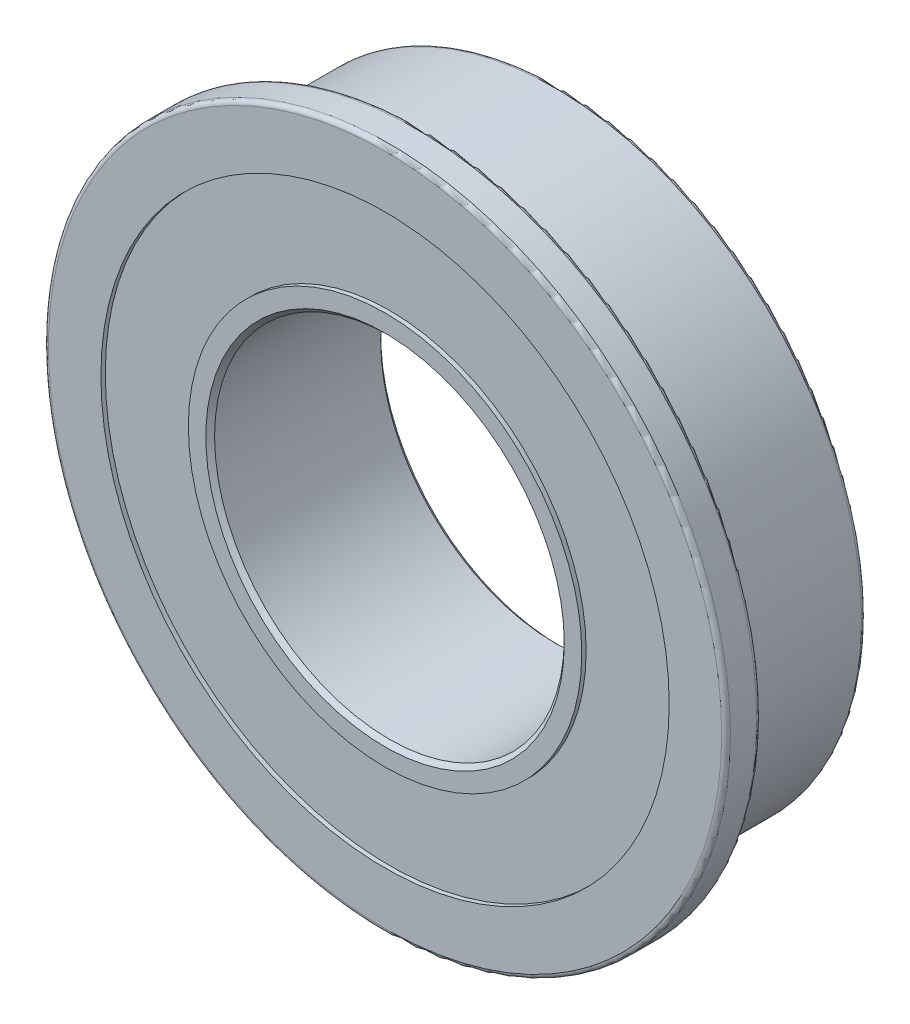
ISO-10303-21;
HEADER;
FILE_DESCRIPTION(('STEP AP214'),'2;1');
FILE_NAME('part.step','',(''),(''),'','','');
FILE_SCHEMA(('AUTOMOTIVE_DESIGN { 1 0 10303 214 1 1 1 1 }'));
ENDSEC;
DATA;
#1=APPLICATION_CONTEXT('core data for automotive mechanical design processes');
#2=APPLICATION_PROTOCOL_DEFINITION('international standard','automotive_design',2000,#1);
#3=PRODUCT_CONTEXT('',#1,'mechanical');
#4=PRODUCT('Part','Part','',(#3));
#5=PRODUCT_RELATED_PRODUCT_CATEGORY('part','',(#4));
#6=PRODUCT_DEFINITION_FORMATION('','',#4);
#7=PRODUCT_DEFINITION_CONTEXT('part definition',#1,'design');
#8=PRODUCT_DEFINITION('design','',#6,#7);
#9=PRODUCT_DEFINITION_SHAPE('','',#8);
#10=(LENGTH_UNIT() NAMED_UNIT(*) SI_UNIT(.MILLI.,.METRE.));
#11=(NAMED_UNIT(*) PLANE_ANGLE_UNIT() SI_UNIT($,.RADIAN.));
#12=(NAMED_UNIT(*) SI_UNIT($,.STERADIAN.) SOLID_ANGLE_UNIT());
#13=UNCERTAINTY_MEASURE_WITH_UNIT(LENGTH_MEASURE(1.E-05),#10,'distance_accuracy_value','');
#14=(GEOMETRIC_REPRESENTATION_CONTEXT(3) GLOBAL_UNCERTAINTY_ASSIGNED_CONTEXT((#13)) GLOBAL_UNIT_ASSIGNED_CONTEXT((#10,
#11,#12)) REPRESENTATION_CONTEXT('',''));
#15=CARTESIAN_POINT('',(0.,0.,0.));
#16=DIRECTION('',(0.,0.,1.));
#17=DIRECTION('',(1.,0.,0.));
#18=AXIS2_PLACEMENT_3D('',#15,#16,#17);
#19=CARTESIAN_POINT('',(0.,0.,0.));
#20=DIRECTION('',(0.,0.,1.));
#21=DIRECTION('',(1.,0.,0.));
#22=AXIS2_PLACEMENT_3D('',#19,#20,#21);
#23=PLANE('',#22);
#24=CARTESIAN_POINT('',(0.,0.,0.));
#25=DIRECTION('',(0.,0.,1.));
#26=DIRECTION('',(1.,0.,0.));
#27=AXIS2_PLACEMENT_3D('',#24,#25,#26);
#28=CIRCLE('',#27,4.1);
#29=CARTESIAN_POINT('',(4.1,0.,0.));
#30=VERTEX_POINT('',#29);
#31=EDGE_CURVE('E28',#30,#30,#28,.T.);
#32=ORIENTED_EDGE('',*,*,#31,.T.);
#33=EDGE_LOOP('',(#32));
#34=FACE_BOUND('',#33,.T.);
#35=CARTESIAN_POINT('',(0.,0.,0.));
#36=DIRECTION('',(0.,0.,-1.));
#37=DIRECTION('',(-1.,0.,0.));
#38=AXIS2_PLACEMENT_3D('',#35,#36,#37);
#39=CIRCLE('',#38,4.5);
#40=CARTESIAN_POINT('',(-4.5,0.,0.));
#41=VERTEX_POINT('',#40);
#42=EDGE_CURVE('E74',#41,#41,#39,.T.);
#43=ORIENTED_EDGE('',*,*,#42,.T.);
#44=EDGE_LOOP('',(#43));
#45=FACE_BOUND('',#44,.T.);
#46=ADVANCED_FACE('F15',(#34,#45),#23,.F.);
#47=CARTESIAN_POINT('',(0.,0.,4.));
#48=DIRECTION('',(0.,0.,1.));
#49=DIRECTION('',(1.,0.,0.));
#50=AXIS2_PLACEMENT_3D('',#47,#48,#49);
#51=PLANE('',#50);
#52=CARTESIAN_POINT('',(0.,0.,4.));
#53=DIRECTION('',(0.,0.,1.));
#54=DIRECTION('',(1.,0.,0.));
#55=AXIS2_PLACEMENT_3D('',#52,#53,#54);
#56=CIRCLE('',#55,4.1);
#57=CARTESIAN_POINT('',(4.1,0.,4.));
#58=VERTEX_POINT('',#57);
#59=EDGE_CURVE('E10',#58,#58,#56,.F.);
#60=ORIENTED_EDGE('',*,*,#59,.T.);
#61=EDGE_LOOP('',(#60));
#62=FACE_BOUND('',#61,.T.);
#63=CARTESIAN_POINT('',(0.,0.,4.));
#64=DIRECTION('',(0.,0.,1.));
#65=DIRECTION('',(1.,0.,0.));
#66=AXIS2_PLACEMENT_3D('',#63,#64,#65);
#67=CIRCLE('',#66,4.5);
#68=CARTESIAN_POINT('',(4.5,0.,4.));
#69=VERTEX_POINT('',#68);
#70=EDGE_CURVE('E64',#69,#69,#67,.T.);
#71=ORIENTED_EDGE('',*,*,#70,.T.);
#72=EDGE_LOOP('',(#71));
#73=FACE_BOUND('',#72,.T.);
#74=ADVANCED_FACE('F111',(#62,#73),#51,.T.);
#75=CARTESIAN_POINT('',(0.,0.,4.));
#76=DIRECTION('',(0.,0.,-1.));
#77=DIRECTION('',(-1.,0.,0.));
#78=AXIS2_PLACEMENT_3D('',#75,#76,#77);
#79=CYLINDRICAL_SURFACE('',#78,7.);
#80=CARTESIAN_POINT('',(0.,0.,0.1));
#81=DIRECTION('',(0.,0.,1.));
#82=DIRECTION('',(1.,0.,0.));
#83=AXIS2_PLACEMENT_3D('',#80,#81,#82);
#84=CIRCLE('',#83,7.);
#85=CARTESIAN_POINT('',(7.,0.,0.1));
#86=VERTEX_POINT('',#85);
#87=EDGE_CURVE('E49',#86,#86,#84,.T.);
#88=ORIENTED_EDGE('',*,*,#87,.T.);
#89=EDGE_LOOP('',(#88));
#90=FACE_BOUND('',#89,.T.);
#91=CARTESIAN_POINT('',(0.,0.,3.2));
#92=DIRECTION('',(0.,0.,1.));
#93=DIRECTION('',(1.,0.,0.));
#94=AXIS2_PLACEMENT_3D('',#91,#92,#93);
#95=CIRCLE('',#94,7.);
#96=CARTESIAN_POINT('',(7.,0.,3.2));
#97=VERTEX_POINT('',#96);
#98=EDGE_CURVE('E52',#97,#97,#95,.T.);
#99=ORIENTED_EDGE('',*,*,#98,.F.);
#100=EDGE_LOOP('',(#99));
#101=FACE_BOUND('',#100,.T.);
#102=ADVANCED_FACE('F112',(#90,#101),#79,.T.);
#103=CARTESIAN_POINT('',(0.,0.,4.));
#104=DIRECTION('',(0.,0.,1.));
#105=DIRECTION('',(1.,0.,0.));
#106=AXIS2_PLACEMENT_3D('',#103,#104,#105);
#107=CIRCLE('',#106,7.7);
#108=CARTESIAN_POINT('',(7.7,0.,4.));
#109=VERTEX_POINT('',#108);
#110=EDGE_CURVE('E34',#109,#109,#107,.T.);
#111=ORIENTED_EDGE('',*,*,#110,.T.);
#112=EDGE_LOOP('',(#111));
#113=FACE_BOUND('',#112,.T.);
#114=CARTESIAN_POINT('',(0.,0.,4.));
#115=DIRECTION('',(0.,0.,1.));
#116=DIRECTION('',(1.,0.,0.));
#117=AXIS2_PLACEMENT_3D('',#114,#115,#116);
#118=CIRCLE('',#117,6.5);
#119=CARTESIAN_POINT('',(6.5,0.,4.));
#120=VERTEX_POINT('',#119);
#121=EDGE_CURVE('E60',#120,#120,#118,.T.);
#122=ORIENTED_EDGE('',*,*,#121,.F.);
#123=EDGE_LOOP('',(#122));
#124=FACE_BOUND('',#123,.T.);
#125=ADVANCED_FACE('F99',(#113,#124),#51,.T.);
#126=CARTESIAN_POINT('',(0.,0.,0.));
#127=DIRECTION('',(0.,0.,1.));
#128=DIRECTION('',(1.,0.,0.));
#129=AXIS2_PLACEMENT_3D('',#126,#127,#128);
#130=CIRCLE('',#129,6.9);
#131=CARTESIAN_POINT('',(6.9,0.,0.));
#132=VERTEX_POINT('',#131);
#133=EDGE_CURVE('E50',#132,#132,#130,.F.);
#134=ORIENTED_EDGE('',*,*,#133,.T.);
#135=EDGE_LOOP('',(#134));
#136=FACE_BOUND('',#135,.T.);
#137=CARTESIAN_POINT('',(0.,0.,0.));
#138=DIRECTION('',(0.,0.,-1.));
#139=DIRECTION('',(-1.,0.,0.));
#140=AXIS2_PLACEMENT_3D('',#137,#138,#139);
#141=CIRCLE('',#140,6.5);
#142=CARTESIAN_POINT('',(-6.5,0.,0.));
#143=VERTEX_POINT('',#142);
#144=EDGE_CURVE('E68',#143,#143,#141,.T.);
#145=ORIENTED_EDGE('',*,*,#144,.F.);
#146=EDGE_LOOP('',(#145));
#147=FACE_BOUND('',#146,.T.);
#148=ADVANCED_FACE('F100',(#136,#147),#23,.F.);
#149=CARTESIAN_POINT('',(0.,0.,4.));
#150=DIRECTION('',(0.,0.,-1.));
#151=DIRECTION('',(-1.,0.,0.));
#152=AXIS2_PLACEMENT_3D('',#149,#150,#151);
#153=CYLINDRICAL_SURFACE('',#152,4.);
#154=CARTESIAN_POINT('',(0.,0.,0.1));
#155=DIRECTION('',(0.,0.,1.));
#156=DIRECTION('',(1.,0.,0.));
#157=AXIS2_PLACEMENT_3D('',#154,#155,#156);
#158=CIRCLE('',#157,4.);
#159=CARTESIAN_POINT('',(4.,0.,0.1));
#160=VERTEX_POINT('',#159);
#161=EDGE_CURVE('E22',#160,#160,#158,.F.);
#162=ORIENTED_EDGE('',*,*,#161,.T.);
#163=EDGE_LOOP('',(#162));
#164=FACE_BOUND('',#163,.T.);
#165=CARTESIAN_POINT('',(0.,0.,3.9));
#166=DIRECTION('',(0.,0.,1.));
#167=DIRECTION('',(1.,0.,0.));
#168=AXIS2_PLACEMENT_3D('',#165,#166,#167);
#169=CIRCLE('',#168,4.);
#170=CARTESIAN_POINT('',(4.,0.,3.9));
#171=VERTEX_POINT('',#170);
#172=EDGE_CURVE('E27',#171,#171,#169,.T.);
#173=ORIENTED_EDGE('',*,*,#172,.T.);
#174=EDGE_LOOP('',(#173));
#175=FACE_BOUND('',#174,.T.);
#176=ADVANCED_FACE('F97',(#164,#175),#153,.F.);
#177=CARTESIAN_POINT('',(0.,0.,3.2));
#178=DIRECTION('',(0.,0.,1.));
#179=DIRECTION('',(1.,0.,0.));
#180=AXIS2_PLACEMENT_3D('',#177,#178,#179);
#181=PLANE('',#180);
#182=CARTESIAN_POINT('',(0.,0.,3.2));
#183=DIRECTION('',(0.,0.,1.));
#184=DIRECTION('',(1.,0.,0.));
#185=AXIS2_PLACEMENT_3D('',#182,#183,#184);
#186=CIRCLE('',#185,7.7);
#187=CARTESIAN_POINT('',(7.7,0.,3.2));
#188=VERTEX_POINT('',#187);
#189=EDGE_CURVE('E36',#188,#188,#186,.F.);
#190=ORIENTED_EDGE('',*,*,#189,.T.);
#191=EDGE_LOOP('',(#190));
#192=FACE_BOUND('',#191,.T.);
#193=ORIENTED_EDGE('',*,*,#98,.T.);
#194=EDGE_LOOP('',(#193));
#195=FACE_BOUND('',#194,.T.);
#196=ADVANCED_FACE('F108',(#192,#195),#181,.F.);
#197=CARTESIAN_POINT('',(0.,0.,3.2));
#198=DIRECTION('',(0.,0.,1.));
#199=DIRECTION('',(1.,0.,0.));
#200=AXIS2_PLACEMENT_3D('',#197,#198,#199);
#201=CYLINDRICAL_SURFACE('',#200,7.8);
#202=CARTESIAN_POINT('',(0.,0.,3.3));
#203=DIRECTION('',(0.,0.,1.));
#204=DIRECTION('',(1.,0.,0.));
#205=AXIS2_PLACEMENT_3D('',#202,#203,#204);
#206=CIRCLE('',#205,7.8);
#207=CARTESIAN_POINT('',(7.8,0.,3.3));
#208=VERTEX_POINT('',#207);
#209=EDGE_CURVE('E41',#208,#208,#206,.T.);
#210=ORIENTED_EDGE('',*,*,#209,.T.);
#211=EDGE_LOOP('',(#210));
#212=FACE_BOUND('',#211,.T.);
#213=CARTESIAN_POINT('',(0.,0.,3.9));
#214=DIRECTION('',(0.,0.,1.));
#215=DIRECTION('',(1.,0.,0.));
#216=AXIS2_PLACEMENT_3D('',#213,#214,#215);
#217=CIRCLE('',#216,7.8);
#218=CARTESIAN_POINT('',(7.8,0.,3.9));
#219=VERTEX_POINT('',#218);
#220=EDGE_CURVE('E42',#219,#219,#217,.F.);
#221=ORIENTED_EDGE('',*,*,#220,.T.);
#222=EDGE_LOOP('',(#221));
#223=FACE_BOUND('',#222,.T.);
#224=ADVANCED_FACE('F150',(#212,#223),#201,.T.);
#225=CARTESIAN_POINT('',(0.,0.,3.9));
#226=DIRECTION('',(0.,0.,1.));
#227=DIRECTION('',(1.,0.,0.));
#228=AXIS2_PLACEMENT_3D('',#225,#226,#227);
#229=CYLINDRICAL_SURFACE('',#228,6.5);
#230=CARTESIAN_POINT('',(0.,0.,3.9));
#231=DIRECTION('',(0.,0.,1.));
#232=DIRECTION('',(1.,0.,0.));
#233=AXIS2_PLACEMENT_3D('',#230,#231,#232);
#234=CIRCLE('',#233,6.5);
#235=CARTESIAN_POINT('',(6.5,0.,3.9));
#236=VERTEX_POINT('',#235);
#237=EDGE_CURVE('E57',#236,#236,#234,.T.);
#238=ORIENTED_EDGE('',*,*,#237,.F.);
#239=EDGE_LOOP('',(#238));
#240=FACE_BOUND('',#239,.T.);
#241=ORIENTED_EDGE('',*,*,#121,.T.);
#242=EDGE_LOOP('',(#241));
#243=FACE_BOUND('',#242,.T.);
#244=ADVANCED_FACE('F141',(#240,#243),#229,.F.);
#245=CARTESIAN_POINT('',(0.,0.,3.9));
#246=DIRECTION('',(0.,0.,1.));
#247=DIRECTION('',(1.,0.,0.));
#248=AXIS2_PLACEMENT_3D('',#245,#246,#247);
#249=PLANE('',#248);
#250=CARTESIAN_POINT('',(0.,0.,3.9));
#251=DIRECTION('',(0.,0.,1.));
#252=DIRECTION('',(1.,0.,0.));
#253=AXIS2_PLACEMENT_3D('',#250,#251,#252);
#254=CIRCLE('',#253,4.5);
#255=CARTESIAN_POINT('',(4.5,0.,3.9));
#256=VERTEX_POINT('',#255);
#257=EDGE_CURVE('E58',#256,#256,#254,.T.);
#258=ORIENTED_EDGE('',*,*,#257,.F.);
#259=EDGE_LOOP('',(#258));
#260=FACE_BOUND('',#259,.T.);
#261=ORIENTED_EDGE('',*,*,#237,.T.);
#262=EDGE_LOOP('',(#261));
#263=FACE_BOUND('',#262,.T.);
#264=ADVANCED_FACE('F136',(#260,#263),#249,.T.);
#265=CARTESIAN_POINT('',(0.,0.,3.9));
#266=DIRECTION('',(0.,0.,1.));
#267=DIRECTION('',(1.,0.,0.));
#268=AXIS2_PLACEMENT_3D('',#265,#266,#267);
#269=CYLINDRICAL_SURFACE('',#268,4.5);
#270=ORIENTED_EDGE('',*,*,#257,.T.);
#271=EDGE_LOOP('',(#270));
#272=FACE_BOUND('',#271,.T.);
#273=ORIENTED_EDGE('',*,*,#70,.F.);
#274=EDGE_LOOP('',(#273));
#275=FACE_BOUND('',#274,.T.);
#276=ADVANCED_FACE('F91',(#272,#275),#269,.T.);
#277=CARTESIAN_POINT('',(0.,0.,0.1));
#278=DIRECTION('',(0.,0.,-1.));
#279=DIRECTION('',(-1.,0.,0.));
#280=AXIS2_PLACEMENT_3D('',#277,#278,#279);
#281=CYLINDRICAL_SURFACE('',#280,6.5);
#282=CARTESIAN_POINT('',(0.,0.,0.1));
#283=DIRECTION('',(0.,0.,-1.));
#284=DIRECTION('',(-1.,0.,0.));
#285=AXIS2_PLACEMENT_3D('',#282,#283,#284);
#286=CIRCLE('',#285,6.5);
#287=CARTESIAN_POINT('',(-6.5,0.,0.1));
#288=VERTEX_POINT('',#287);
#289=EDGE_CURVE('E69',#288,#288,#286,.T.);
#290=ORIENTED_EDGE('',*,*,#289,.F.);
#291=EDGE_LOOP('',(#290));
#292=FACE_BOUND('',#291,.T.);
#293=ORIENTED_EDGE('',*,*,#144,.T.);
#294=EDGE_LOOP('',(#293));
#295=FACE_BOUND('',#294,.T.);
#296=ADVANCED_FACE('F87',(#292,#295),#281,.F.);
#297=CARTESIAN_POINT('',(0.,0.,0.1));
#298=DIRECTION('',(0.,0.,-1.));
#299=DIRECTION('',(-1.,0.,0.));
#300=AXIS2_PLACEMENT_3D('',#297,#298,#299);
#301=PLANE('',#300);
#302=CARTESIAN_POINT('',(0.,0.,0.1));
#303=DIRECTION('',(0.,0.,-1.));
#304=DIRECTION('',(-1.,0.,0.));
#305=AXIS2_PLACEMENT_3D('',#302,#303,#304);
#306=CIRCLE('',#305,4.5);
#307=CARTESIAN_POINT('',(-4.5,0.,0.1));
#308=VERTEX_POINT('',#307);
#309=EDGE_CURVE('E71',#308,#308,#306,.T.);
#310=ORIENTED_EDGE('',*,*,#309,.F.);
#311=EDGE_LOOP('',(#310));
#312=FACE_BOUND('',#311,.T.);
#313=ORIENTED_EDGE('',*,*,#289,.T.);
#314=EDGE_LOOP('',(#313));
#315=FACE_BOUND('',#314,.T.);
#316=ADVANCED_FACE('F81',(#312,#315),#301,.T.);
#317=CARTESIAN_POINT('',(0.,0.,0.1));
#318=DIRECTION('',(0.,0.,-1.));
#319=DIRECTION('',(-1.,0.,0.));
#320=AXIS2_PLACEMENT_3D('',#317,#318,#319);
#321=CYLINDRICAL_SURFACE('',#320,4.5);
#322=ORIENTED_EDGE('',*,*,#309,.T.);
#323=EDGE_LOOP('',(#322));
#324=FACE_BOUND('',#323,.T.);
#325=ORIENTED_EDGE('',*,*,#42,.F.);
#326=EDGE_LOOP('',(#325));
#327=FACE_BOUND('',#326,.T.);
#328=ADVANCED_FACE('F82',(#324,#327),#321,.T.);
#329=CARTESIAN_POINT('',(0.,0.,0.1));
#330=DIRECTION('',(0.,0.,1.));
#331=DIRECTION('',(1.,0.,0.));
#332=AXIS2_PLACEMENT_3D('',#329,#330,#331);
#333=TOROIDAL_SURFACE('',#332,6.9,0.1);
#334=ORIENTED_EDGE('',*,*,#133,.F.);
#335=EDGE_LOOP('',(#334));
#336=FACE_BOUND('',#335,.T.);
#337=ORIENTED_EDGE('',*,*,#87,.F.);
#338=EDGE_LOOP('',(#337));
#339=FACE_BOUND('',#338,.T.);
#340=ADVANCED_FACE('F130',(#336,#339),#333,.T.);
#341=CARTESIAN_POINT('',(0.,0.,3.3));
#342=DIRECTION('',(0.,0.,1.));
#343=DIRECTION('',(1.,0.,0.));
#344=AXIS2_PLACEMENT_3D('',#341,#342,#343);
#345=TOROIDAL_SURFACE('',#344,7.7,0.1);
#346=ORIENTED_EDGE('',*,*,#189,.F.);
#347=EDGE_LOOP('',(#346));
#348=FACE_BOUND('',#347,.T.);
#349=ORIENTED_EDGE('',*,*,#209,.F.);
#350=EDGE_LOOP('',(#349));
#351=FACE_BOUND('',#350,.T.);
#352=ADVANCED_FACE('F132',(#348,#351),#345,.T.);
#353=CARTESIAN_POINT('',(0.,0.,3.9));
#354=DIRECTION('',(0.,0.,1.));
#355=DIRECTION('',(1.,0.,0.));
#356=AXIS2_PLACEMENT_3D('',#353,#354,#355);
#357=TOROIDAL_SURFACE('',#356,7.7,0.1);
#358=ORIENTED_EDGE('',*,*,#220,.F.);
#359=EDGE_LOOP('',(#358));
#360=FACE_BOUND('',#359,.T.);
#361=ORIENTED_EDGE('',*,*,#110,.F.);
#362=EDGE_LOOP('',(#361));
#363=FACE_BOUND('',#362,.T.);
#364=ADVANCED_FACE('F161',(#360,#363),#357,.T.);
#365=CARTESIAN_POINT('',(0.,0.,0.));
#366=DIRECTION('',(0.,0.,-1.));
#367=DIRECTION('',(-1.,0.,0.));
#368=AXIS2_PLACEMENT_3D('',#365,#366,#367);
#369=CONICAL_SURFACE('',#368,4.1,0.785398163397457);
#370=ORIENTED_EDGE('',*,*,#161,.F.);
#371=EDGE_LOOP('',(#370));
#372=FACE_BOUND('',#371,.T.);
#373=ORIENTED_EDGE('',*,*,#31,.F.);
#374=EDGE_LOOP('',(#373));
#375=FACE_BOUND('',#374,.T.);
#376=ADVANCED_FACE('F163',(#372,#375),#369,.F.);
#377=CARTESIAN_POINT('',(0.,0.,3.9));
#378=DIRECTION('',(0.,0.,1.));
#379=DIRECTION('',(1.,0.,0.));
#380=AXIS2_PLACEMENT_3D('',#377,#378,#379);
#381=CONICAL_SURFACE('',#380,4.,0.785398163397466);
#382=ORIENTED_EDGE('',*,*,#59,.F.);
#383=EDGE_LOOP('',(#382));
#384=FACE_BOUND('',#383,.T.);
#385=ORIENTED_EDGE('',*,*,#172,.F.);
#386=EDGE_LOOP('',(#385));
#387=FACE_BOUND('',#386,.T.);
#388=ADVANCED_FACE('F17',(#384,#387),#381,.F.);
#389=CLOSED_SHELL('',(#46,#74,#102,#125,#148,#176,#196,#224,#244,#264,#276,#296,#316,#328,#340,
#352,#364,#376,#388));
#390=MANIFOLD_SOLID_BREP('B1',#389);
#391=ADVANCED_BREP_SHAPE_REPRESENTATION('',(#18,#390),#14);
#392=SHAPE_DEFINITION_REPRESENTATION(#9,#391);
ENDSEC;
END-ISO-10303-21;
